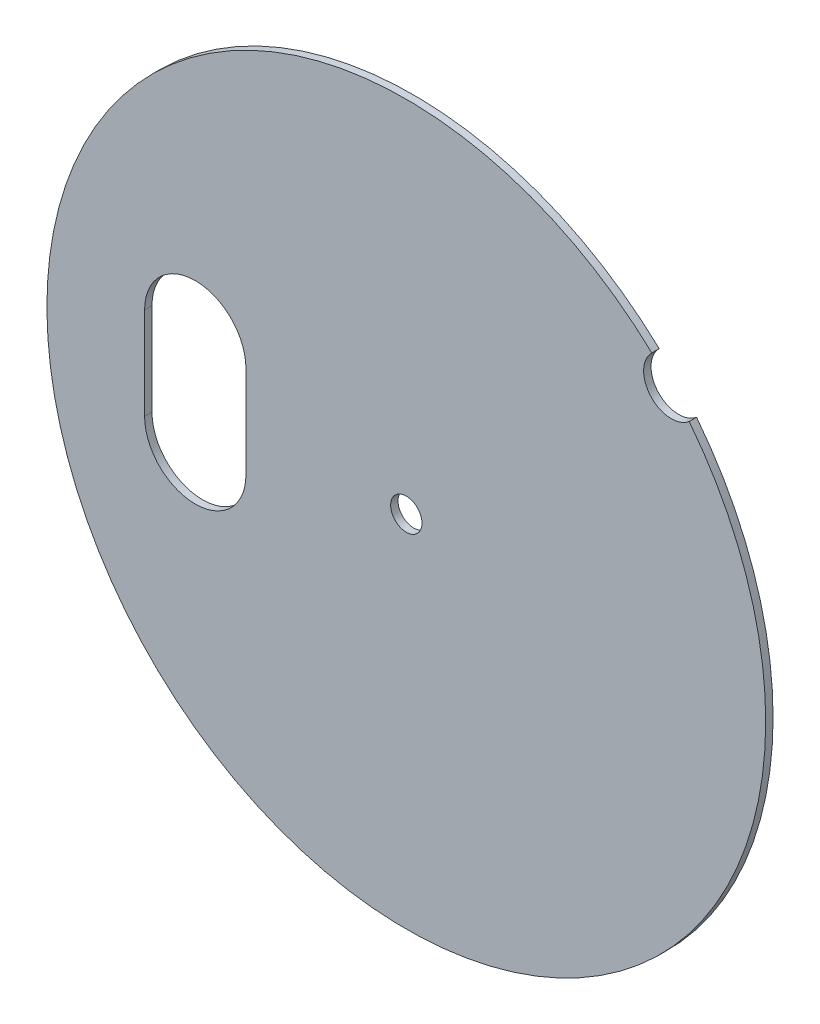
ISO-10303-21;
HEADER;
FILE_DESCRIPTION(('STEP AP214'),'2;1');
FILE_NAME('part.step','',(''),(''),'','','');
FILE_SCHEMA(('AUTOMOTIVE_DESIGN { 1 0 10303 214 1 1 1 1 }'));
ENDSEC;
DATA;
#1=APPLICATION_CONTEXT('core data for automotive mechanical design processes');
#2=APPLICATION_PROTOCOL_DEFINITION('international standard','automotive_design',2000,#1);
#3=PRODUCT_CONTEXT('',#1,'mechanical');
#4=PRODUCT('Part','Part','',(#3));
#5=PRODUCT_RELATED_PRODUCT_CATEGORY('part','',(#4));
#6=PRODUCT_DEFINITION_FORMATION('','',#4);
#7=PRODUCT_DEFINITION_CONTEXT('part definition',#1,'design');
#8=PRODUCT_DEFINITION('design','',#6,#7);
#9=PRODUCT_DEFINITION_SHAPE('','',#8);
#10=(LENGTH_UNIT() NAMED_UNIT(*) SI_UNIT(.MILLI.,.METRE.));
#11=(NAMED_UNIT(*) PLANE_ANGLE_UNIT() SI_UNIT($,.RADIAN.));
#12=(NAMED_UNIT(*) SI_UNIT($,.STERADIAN.) SOLID_ANGLE_UNIT());
#13=UNCERTAINTY_MEASURE_WITH_UNIT(LENGTH_MEASURE(1.E-05),#10,'distance_accuracy_value','');
#14=(GEOMETRIC_REPRESENTATION_CONTEXT(3) GLOBAL_UNCERTAINTY_ASSIGNED_CONTEXT((#13)) GLOBAL_UNIT_ASSIGNED_CONTEXT((#10,
#11,#12)) REPRESENTATION_CONTEXT('',''));
#15=CARTESIAN_POINT('',(0.,0.,0.));
#16=DIRECTION('',(0.,0.,1.));
#17=DIRECTION('',(1.,0.,0.));
#18=AXIS2_PLACEMENT_3D('',#15,#16,#17);
#19=CARTESIAN_POINT('',(7.1884540338987,6.5870045242527,0.4));
#20=DIRECTION('',(0.,0.,1.));
#21=DIRECTION('',(1.,0.,0.));
#22=AXIS2_PLACEMENT_3D('',#19,#20,#21);
#23=PLANE('',#22);
#24=CARTESIAN_POINT('',(14.3769080677974,13.1740090485054,0.4));
#25=DIRECTION('',(0.,0.,-1.));
#26=DIRECTION('',(1.,0.,0.));
#27=AXIS2_PLACEMENT_3D('',#24,#25,#26);
#28=CIRCLE('',#27,1.5);
#29=CARTESIAN_POINT('',(15.3470083254984,12.0299349731028,0.4));
#30=VERTEX_POINT('',#29);
#31=CARTESIAN_POINT('',(13.3217373481567,14.2401304076447,0.4));
#32=VERTEX_POINT('',#31);
#33=EDGE_CURVE('E136',#30,#32,#28,.T.);
#34=ORIENTED_EDGE('',*,*,#33,.T.);
#35=CARTESIAN_POINT('',(0.,0.,0.4));
#36=DIRECTION('',(0.,0.,1.));
#37=DIRECTION('',(1.,0.,0.));
#38=AXIS2_PLACEMENT_3D('',#35,#36,#37);
#39=CIRCLE('',#38,19.5);
#40=EDGE_CURVE('E139',#32,#30,#39,.T.);
#41=ORIENTED_EDGE('',*,*,#40,.T.);
#42=EDGE_LOOP('',(#34,#41));
#43=FACE_BOUND('',#42,.T.);
#44=CARTESIAN_POINT('',(0.,0.,0.4));
#45=DIRECTION('',(0.,0.,1.));
#46=DIRECTION('',(1.,0.,0.));
#47=AXIS2_PLACEMENT_3D('',#44,#45,#46);
#48=CIRCLE('',#47,0.85);
#49=CARTESIAN_POINT('',(0.85,0.,0.4));
#50=VERTEX_POINT('',#49);
#51=EDGE_CURVE('E130',#50,#50,#48,.T.);
#52=ORIENTED_EDGE('',*,*,#51,.F.);
#53=EDGE_LOOP('',(#52));
#54=FACE_BOUND('',#53,.T.);
#55=DIRECTION('',(0.,1.,0.));
#56=VECTOR('',#55,1.);
#57=CARTESIAN_POINT('',(-8.7,-2.5,0.4));
#58=LINE('',#57,#56);
#59=CARTESIAN_POINT('',(-8.7,-2.5,0.4));
#60=VERTEX_POINT('',#59);
#61=CARTESIAN_POINT('',(-8.7,2.5,0.4));
#62=VERTEX_POINT('',#61);
#63=EDGE_CURVE('E102',#60,#62,#58,.T.);
#64=ORIENTED_EDGE('',*,*,#63,.F.);
#65=CARTESIAN_POINT('',(-11.45,-2.5,0.4));
#66=DIRECTION('',(0.,0.,1.));
#67=DIRECTION('',(1.,0.,0.));
#68=AXIS2_PLACEMENT_3D('',#65,#66,#67);
#69=CIRCLE('',#68,2.75);
#70=CARTESIAN_POINT('',(-14.2,-2.5,0.4));
#71=VERTEX_POINT('',#70);
#72=EDGE_CURVE('E94',#71,#60,#69,.T.);
#73=ORIENTED_EDGE('',*,*,#72,.F.);
#74=DIRECTION('',(0.,-1.,0.));
#75=VECTOR('',#74,1.);
#76=CARTESIAN_POINT('',(-14.2,-2.5,0.4));
#77=LINE('',#76,#75);
#78=CARTESIAN_POINT('',(-14.2,2.5,0.4));
#79=VERTEX_POINT('',#78);
#80=EDGE_CURVE('E116',#79,#71,#77,.T.);
#81=ORIENTED_EDGE('',*,*,#80,.F.);
#82=CARTESIAN_POINT('',(-11.45,2.5,0.4));
#83=DIRECTION('',(0.,0.,1.));
#84=DIRECTION('',(1.,0.,0.));
#85=AXIS2_PLACEMENT_3D('',#82,#83,#84);
#86=CIRCLE('',#85,2.75);
#87=EDGE_CURVE('E114',#62,#79,#86,.T.);
#88=ORIENTED_EDGE('',*,*,#87,.F.);
#89=EDGE_LOOP('',(#64,#73,#81,#88));
#90=FACE_BOUND('',#89,.T.);
#91=ADVANCED_FACE('F41',(#43,#54,#90),#23,.T.);
#92=CARTESIAN_POINT('',(7.1884540338987,6.5870045242527,0.));
#93=DIRECTION('',(0.,0.,1.));
#94=DIRECTION('',(1.,0.,0.));
#95=AXIS2_PLACEMENT_3D('',#92,#93,#94);
#96=PLANE('',#95);
#97=CARTESIAN_POINT('',(0.,0.,0.));
#98=DIRECTION('',(0.,0.,1.));
#99=DIRECTION('',(1.,0.,0.));
#100=AXIS2_PLACEMENT_3D('',#97,#98,#99);
#101=CIRCLE('',#100,0.85);
#102=CARTESIAN_POINT('',(0.85,0.,0.));
#103=VERTEX_POINT('',#102);
#104=EDGE_CURVE('E110',#103,#103,#101,.T.);
#105=ORIENTED_EDGE('',*,*,#104,.T.);
#106=EDGE_LOOP('',(#105));
#107=FACE_BOUND('',#106,.T.);
#108=CARTESIAN_POINT('',(14.3769080677974,13.1740090485054,0.));
#109=DIRECTION('',(0.,0.,-1.));
#110=DIRECTION('',(1.,0.,0.));
#111=AXIS2_PLACEMENT_3D('',#108,#109,#110);
#112=CIRCLE('',#111,1.5);
#113=CARTESIAN_POINT('',(15.3470083254984,12.0299349731028,0.));
#114=VERTEX_POINT('',#113);
#115=CARTESIAN_POINT('',(13.3217373481567,14.2401304076447,0.));
#116=VERTEX_POINT('',#115);
#117=EDGE_CURVE('E133',#114,#116,#112,.T.);
#118=ORIENTED_EDGE('',*,*,#117,.F.);
#119=CARTESIAN_POINT('',(0.,0.,0.));
#120=DIRECTION('',(0.,0.,1.));
#121=DIRECTION('',(1.,0.,0.));
#122=AXIS2_PLACEMENT_3D('',#119,#120,#121);
#123=CIRCLE('',#122,19.5);
#124=EDGE_CURVE('E140',#116,#114,#123,.T.);
#125=ORIENTED_EDGE('',*,*,#124,.F.);
#126=EDGE_LOOP('',(#118,#125));
#127=FACE_BOUND('',#126,.T.);
#128=CARTESIAN_POINT('',(-11.45,-2.5,0.));
#129=DIRECTION('',(0.,0.,1.));
#130=DIRECTION('',(1.,0.,0.));
#131=AXIS2_PLACEMENT_3D('',#128,#129,#130);
#132=CIRCLE('',#131,2.75);
#133=CARTESIAN_POINT('',(-14.2,-2.5,0.));
#134=VERTEX_POINT('',#133);
#135=CARTESIAN_POINT('',(-8.7,-2.5,0.));
#136=VERTEX_POINT('',#135);
#137=EDGE_CURVE('E64',#134,#136,#132,.T.);
#138=ORIENTED_EDGE('',*,*,#137,.T.);
#139=DIRECTION('',(0.,1.,0.));
#140=VECTOR('',#139,1.);
#141=CARTESIAN_POINT('',(-8.7,-2.5,0.));
#142=LINE('',#141,#140);
#143=CARTESIAN_POINT('',(-8.7,2.5,0.));
#144=VERTEX_POINT('',#143);
#145=EDGE_CURVE('E109',#136,#144,#142,.T.);
#146=ORIENTED_EDGE('',*,*,#145,.T.);
#147=CARTESIAN_POINT('',(-11.45,2.5,0.));
#148=DIRECTION('',(0.,0.,1.));
#149=DIRECTION('',(1.,0.,0.));
#150=AXIS2_PLACEMENT_3D('',#147,#148,#149);
#151=CIRCLE('',#150,2.75);
#152=CARTESIAN_POINT('',(-14.2,2.5,0.));
#153=VERTEX_POINT('',#152);
#154=EDGE_CURVE('E122',#144,#153,#151,.T.);
#155=ORIENTED_EDGE('',*,*,#154,.T.);
#156=DIRECTION('',(0.,-1.,0.));
#157=VECTOR('',#156,1.);
#158=CARTESIAN_POINT('',(-14.2,-2.5,0.));
#159=LINE('',#158,#157);
#160=EDGE_CURVE('E103',#153,#134,#159,.T.);
#161=ORIENTED_EDGE('',*,*,#160,.T.);
#162=EDGE_LOOP('',(#138,#146,#155,#161));
#163=FACE_BOUND('',#162,.T.);
#164=ADVANCED_FACE('F152',(#107,#127,#163),#96,.F.);
#165=CARTESIAN_POINT('',(14.3769080677974,13.1740090485054,0.4));
#166=DIRECTION('',(0.,0.,-1.));
#167=DIRECTION('',(-1.,0.,0.));
#168=AXIS2_PLACEMENT_3D('',#165,#166,#167);
#169=CYLINDRICAL_SURFACE('',#168,1.5);
#170=ORIENTED_EDGE('',*,*,#117,.T.);
#171=DIRECTION('',(0.,0.,-1.));
#172=VECTOR('',#171,1.);
#173=CARTESIAN_POINT('',(13.3217373481567,14.2401304076447,0.4));
#174=LINE('',#173,#172);
#175=EDGE_CURVE('E11',#32,#116,#174,.T.);
#176=ORIENTED_EDGE('',*,*,#175,.F.);
#177=ORIENTED_EDGE('',*,*,#33,.F.);
#178=DIRECTION('',(0.,0.,-1.));
#179=VECTOR('',#178,1.);
#180=CARTESIAN_POINT('',(15.3470083254984,12.0299349731028,0.4));
#181=LINE('',#180,#179);
#182=EDGE_CURVE('E49',#30,#114,#181,.T.);
#183=ORIENTED_EDGE('',*,*,#182,.T.);
#184=EDGE_LOOP('',(#170,#176,#177,#183));
#185=FACE_BOUND('',#184,.T.);
#186=ADVANCED_FACE('F43',(#185),#169,.F.);
#187=CARTESIAN_POINT('',(0.,0.,0.4));
#188=DIRECTION('',(0.,0.,-1.));
#189=DIRECTION('',(-1.,0.,0.));
#190=AXIS2_PLACEMENT_3D('',#187,#188,#189);
#191=CYLINDRICAL_SURFACE('',#190,19.5);
#192=ORIENTED_EDGE('',*,*,#124,.T.);
#193=ORIENTED_EDGE('',*,*,#182,.F.);
#194=ORIENTED_EDGE('',*,*,#40,.F.);
#195=ORIENTED_EDGE('',*,*,#175,.T.);
#196=EDGE_LOOP('',(#192,#193,#194,#195));
#197=FACE_BOUND('',#196,.T.);
#198=ADVANCED_FACE('F154',(#197),#191,.T.);
#199=CARTESIAN_POINT('',(0.,0.,0.4));
#200=DIRECTION('',(0.,0.,-1.));
#201=DIRECTION('',(-1.,0.,0.));
#202=AXIS2_PLACEMENT_3D('',#199,#200,#201);
#203=CYLINDRICAL_SURFACE('',#202,0.85);
#204=ORIENTED_EDGE('',*,*,#51,.T.);
#205=EDGE_LOOP('',(#204));
#206=FACE_BOUND('',#205,.T.);
#207=ORIENTED_EDGE('',*,*,#104,.F.);
#208=EDGE_LOOP('',(#207));
#209=FACE_BOUND('',#208,.T.);
#210=ADVANCED_FACE('F161',(#206,#209),#203,.F.);
#211=CARTESIAN_POINT('',(-11.45,-2.5,0.4));
#212=DIRECTION('',(0.,0.,-1.));
#213=DIRECTION('',(-1.,0.,0.));
#214=AXIS2_PLACEMENT_3D('',#211,#212,#213);
#215=CYLINDRICAL_SURFACE('',#214,2.75);
#216=ORIENTED_EDGE('',*,*,#137,.F.);
#217=DIRECTION('',(0.,0.,-1.));
#218=VECTOR('',#217,1.);
#219=CARTESIAN_POINT('',(-14.2,-2.5,0.4));
#220=LINE('',#219,#218);
#221=EDGE_CURVE('E98',#71,#134,#220,.T.);
#222=ORIENTED_EDGE('',*,*,#221,.F.);
#223=ORIENTED_EDGE('',*,*,#72,.T.);
#224=DIRECTION('',(0.,0.,-1.));
#225=VECTOR('',#224,1.);
#226=CARTESIAN_POINT('',(-8.7,-2.5,0.4));
#227=LINE('',#226,#225);
#228=EDGE_CURVE('E97',#60,#136,#227,.T.);
#229=ORIENTED_EDGE('',*,*,#228,.T.);
#230=EDGE_LOOP('',(#216,#222,#223,#229));
#231=FACE_BOUND('',#230,.T.);
#232=ADVANCED_FACE('F96',(#231),#215,.F.);
#233=CARTESIAN_POINT('',(-8.7,-2.5,0.4));
#234=DIRECTION('',(-1.,0.,0.));
#235=DIRECTION('',(0.,-1.,0.));
#236=AXIS2_PLACEMENT_3D('',#233,#234,#235);
#237=PLANE('',#236);
#238=ORIENTED_EDGE('',*,*,#145,.F.);
#239=ORIENTED_EDGE('',*,*,#228,.F.);
#240=ORIENTED_EDGE('',*,*,#63,.T.);
#241=DIRECTION('',(0.,0.,-1.));
#242=VECTOR('',#241,1.);
#243=CARTESIAN_POINT('',(-8.7,2.5,0.4));
#244=LINE('',#243,#242);
#245=EDGE_CURVE('E111',#62,#144,#244,.T.);
#246=ORIENTED_EDGE('',*,*,#245,.T.);
#247=EDGE_LOOP('',(#238,#239,#240,#246));
#248=FACE_BOUND('',#247,.T.);
#249=ADVANCED_FACE('F106',(#248),#237,.T.);
#250=CARTESIAN_POINT('',(-11.45,2.5,0.4));
#251=DIRECTION('',(0.,0.,-1.));
#252=DIRECTION('',(-1.,0.,0.));
#253=AXIS2_PLACEMENT_3D('',#250,#251,#252);
#254=CYLINDRICAL_SURFACE('',#253,2.75);
#255=ORIENTED_EDGE('',*,*,#154,.F.);
#256=ORIENTED_EDGE('',*,*,#245,.F.);
#257=ORIENTED_EDGE('',*,*,#87,.T.);
#258=DIRECTION('',(0.,0.,-1.));
#259=VECTOR('',#258,1.);
#260=CARTESIAN_POINT('',(-14.2,2.5,0.4));
#261=LINE('',#260,#259);
#262=EDGE_CURVE('E56',#79,#153,#261,.T.);
#263=ORIENTED_EDGE('',*,*,#262,.T.);
#264=EDGE_LOOP('',(#255,#256,#257,#263));
#265=FACE_BOUND('',#264,.T.);
#266=ADVANCED_FACE('F196',(#265),#254,.F.);
#267=CARTESIAN_POINT('',(-14.2,-2.5,0.4));
#268=DIRECTION('',(1.,0.,0.));
#269=DIRECTION('',(0.,1.,0.));
#270=AXIS2_PLACEMENT_3D('',#267,#268,#269);
#271=PLANE('',#270);
#272=ORIENTED_EDGE('',*,*,#160,.F.);
#273=ORIENTED_EDGE('',*,*,#262,.F.);
#274=ORIENTED_EDGE('',*,*,#80,.T.);
#275=ORIENTED_EDGE('',*,*,#221,.T.);
#276=EDGE_LOOP('',(#272,#273,#274,#275));
#277=FACE_BOUND('',#276,.T.);
#278=ADVANCED_FACE('F204',(#277),#271,.T.);
#279=CLOSED_SHELL('',(#91,#164,#186,#198,#210,#232,#249,#266,#278));
#280=MANIFOLD_SOLID_BREP('B2',#279);
#281=ADVANCED_BREP_SHAPE_REPRESENTATION('',(#18,#280),#14);
#282=SHAPE_DEFINITION_REPRESENTATION(#9,#281);
ENDSEC;
END-ISO-10303-21;
